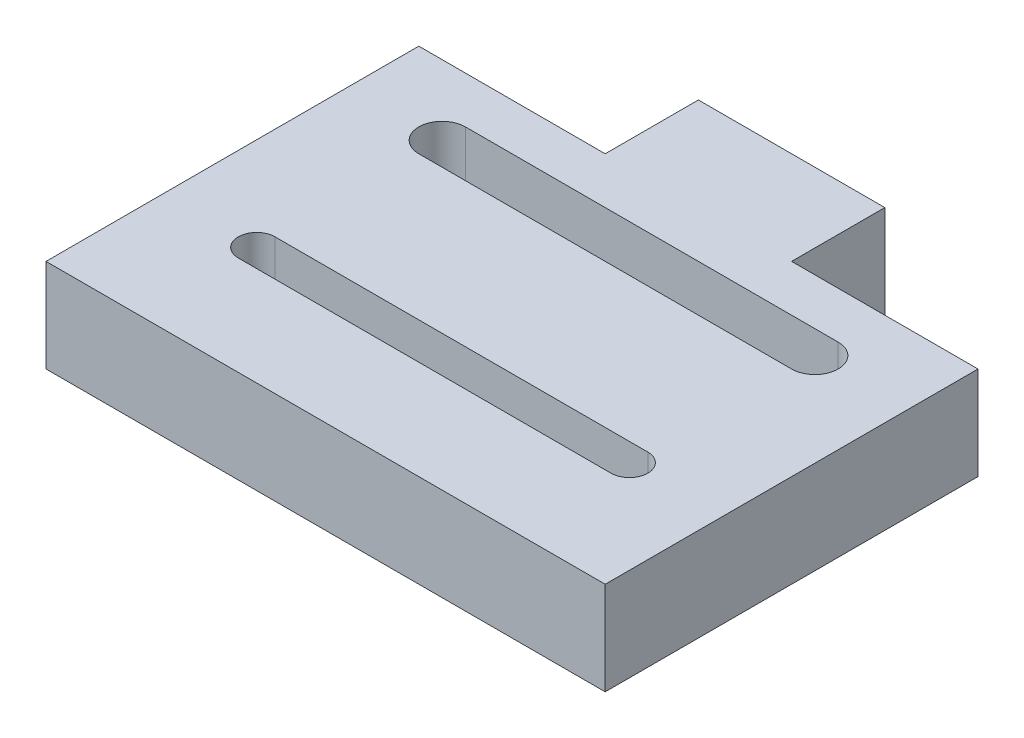
ISO-10303-21;
HEADER;
FILE_DESCRIPTION(('STEP AP214'),'2;1');
FILE_NAME('part.step','',(''),(''),'','','');
FILE_SCHEMA(('AUTOMOTIVE_DESIGN { 1 0 10303 214 1 1 1 1 }'));
ENDSEC;
DATA;
#1=APPLICATION_CONTEXT('core data for automotive mechanical design processes');
#2=APPLICATION_PROTOCOL_DEFINITION('international standard','automotive_design',2000,#1);
#3=PRODUCT_CONTEXT('',#1,'mechanical');
#4=PRODUCT('Part','Part','',(#3));
#5=PRODUCT_RELATED_PRODUCT_CATEGORY('part','',(#4));
#6=PRODUCT_DEFINITION_FORMATION('','',#4);
#7=PRODUCT_DEFINITION_CONTEXT('part definition',#1,'design');
#8=PRODUCT_DEFINITION('design','',#6,#7);
#9=PRODUCT_DEFINITION_SHAPE('','',#8);
#10=(LENGTH_UNIT() NAMED_UNIT(*) SI_UNIT(.MILLI.,.METRE.));
#11=(NAMED_UNIT(*) PLANE_ANGLE_UNIT() SI_UNIT($,.RADIAN.));
#12=(NAMED_UNIT(*) SI_UNIT($,.STERADIAN.) SOLID_ANGLE_UNIT());
#13=UNCERTAINTY_MEASURE_WITH_UNIT(LENGTH_MEASURE(1.E-05),#10,'distance_accuracy_value','');
#14=(GEOMETRIC_REPRESENTATION_CONTEXT(3) GLOBAL_UNCERTAINTY_ASSIGNED_CONTEXT((#13)) GLOBAL_UNIT_ASSIGNED_CONTEXT((#10,
#11,#12)) REPRESENTATION_CONTEXT('',''));
#15=CARTESIAN_POINT('',(0.,0.,0.));
#16=DIRECTION('',(0.,0.,1.));
#17=DIRECTION('',(1.,0.,0.));
#18=AXIS2_PLACEMENT_3D('',#15,#16,#17);
#19=CARTESIAN_POINT('',(19.05,-6.34833682660208,25.4));
#20=DIRECTION('',(0.,-1.,0.));
#21=DIRECTION('',(0.,0.,-1.));
#22=AXIS2_PLACEMENT_3D('',#19,#20,#21);
#23=PLANE('',#22);
#24=CARTESIAN_POINT('',(-12.7,-6.34833682660208,17.399));
#25=DIRECTION('',(0.,1.,0.));
#26=DIRECTION('',(0.,0.,1.));
#27=AXIS2_PLACEMENT_3D('',#24,#25,#26);
#28=CIRCLE('',#27,1.25);
#29=CARTESIAN_POINT('',(-12.7,-6.34833682660208,18.649));
#30=VERTEX_POINT('',#29);
#31=CARTESIAN_POINT('',(-12.7,-6.34833682660208,16.149));
#32=VERTEX_POINT('',#31);
#33=EDGE_CURVE('E297',#30,#32,#28,.F.);
#34=ORIENTED_EDGE('',*,*,#33,.T.);
#35=DIRECTION('',(-1.,0.,0.));
#36=VECTOR('',#35,1.);
#37=CARTESIAN_POINT('',(0.,-6.34833682660208,16.149));
#38=LINE('',#37,#36);
#39=CARTESIAN_POINT('',(12.7,-6.34833682660208,16.149));
#40=VERTEX_POINT('',#39);
#41=EDGE_CURVE('E294',#40,#32,#38,.T.);
#42=ORIENTED_EDGE('',*,*,#41,.F.);
#43=CARTESIAN_POINT('',(12.7,-6.34833682660208,17.399));
#44=DIRECTION('',(0.,1.,0.));
#45=DIRECTION('',(0.,0.,1.));
#46=AXIS2_PLACEMENT_3D('',#43,#44,#45);
#47=CIRCLE('',#46,1.25);
#48=CARTESIAN_POINT('',(12.7,-6.34833682660208,18.649));
#49=VERTEX_POINT('',#48);
#50=EDGE_CURVE('E310',#49,#40,#47,.T.);
#51=ORIENTED_EDGE('',*,*,#50,.F.);
#52=DIRECTION('',(-1.,0.,0.));
#53=VECTOR('',#52,1.);
#54=CARTESIAN_POINT('',(0.,-6.34833682660208,18.649));
#55=LINE('',#54,#53);
#56=EDGE_CURVE('E302',#49,#30,#55,.T.);
#57=ORIENTED_EDGE('',*,*,#56,.T.);
#58=EDGE_LOOP('',(#34,#42,#51,#57));
#59=FACE_BOUND('',#58,.T.);
#60=DIRECTION('',(-1.,0.,0.));
#61=VECTOR('',#60,1.);
#62=CARTESIAN_POINT('',(19.05,-6.34833682660208,0.));
#63=LINE('',#62,#61);
#64=CARTESIAN_POINT('',(19.05,-6.34833682660208,0.));
#65=VERTEX_POINT('',#64);
#66=CARTESIAN_POINT('',(6.35000000000001,-6.34833682660208,0.));
#67=VERTEX_POINT('',#66);
#68=EDGE_CURVE('E342',#65,#67,#63,.T.);
#69=ORIENTED_EDGE('',*,*,#68,.T.);
#70=DIRECTION('',(0.,0.,1.));
#71=VECTOR('',#70,1.);
#72=CARTESIAN_POINT('',(6.35,-6.34833682660247,-6.35));
#73=LINE('',#72,#71);
#74=CARTESIAN_POINT('',(6.35,-6.34833682660247,-6.35));
#75=VERTEX_POINT('',#74);
#76=EDGE_CURVE('E182',#75,#67,#73,.T.);
#77=ORIENTED_EDGE('',*,*,#76,.F.);
#78=DIRECTION('',(1.,0.,0.));
#79=VECTOR('',#78,1.);
#80=CARTESIAN_POINT('',(6.35,-6.34833682660247,-6.35));
#81=LINE('',#80,#79);
#82=CARTESIAN_POINT('',(-6.35,-6.34833682660247,-6.35));
#83=VERTEX_POINT('',#82);
#84=EDGE_CURVE('E180',#83,#75,#81,.T.);
#85=ORIENTED_EDGE('',*,*,#84,.F.);
#86=DIRECTION('',(0.,0.,1.));
#87=VECTOR('',#86,1.);
#88=CARTESIAN_POINT('',(-6.35,-6.34833682660247,-6.35));
#89=LINE('',#88,#87);
#90=CARTESIAN_POINT('',(-6.35,-6.34833682660247,0.));
#91=VERTEX_POINT('',#90);
#92=EDGE_CURVE('E195',#83,#91,#89,.T.);
#93=ORIENTED_EDGE('',*,*,#92,.T.);
#94=CARTESIAN_POINT('',(-19.05,-6.34833682660208,0.));
#95=VERTEX_POINT('',#94);
#96=EDGE_CURVE('E282',#91,#95,#63,.T.);
#97=ORIENTED_EDGE('',*,*,#96,.T.);
#98=DIRECTION('',(0.,0.,-1.));
#99=VECTOR('',#98,1.);
#100=CARTESIAN_POINT('',(-19.05,-6.34833682660208,25.4));
#101=LINE('',#100,#99);
#102=CARTESIAN_POINT('',(-19.05,-6.34833682660208,25.4));
#103=VERTEX_POINT('',#102);
#104=EDGE_CURVE('E355',#103,#95,#101,.T.);
#105=ORIENTED_EDGE('',*,*,#104,.F.);
#106=DIRECTION('',(-1.,0.,0.));
#107=VECTOR('',#106,1.);
#108=CARTESIAN_POINT('',(19.05,-6.34833682660208,25.4));
#109=LINE('',#108,#107);
#110=CARTESIAN_POINT('',(19.05,-6.34833682660208,25.4));
#111=VERTEX_POINT('',#110);
#112=EDGE_CURVE('E326',#111,#103,#109,.T.);
#113=ORIENTED_EDGE('',*,*,#112,.F.);
#114=DIRECTION('',(0.,0.,-1.));
#115=VECTOR('',#114,1.);
#116=CARTESIAN_POINT('',(19.05,-6.34833682660208,25.4));
#117=LINE('',#116,#115);
#118=EDGE_CURVE('E200',#111,#65,#117,.T.);
#119=ORIENTED_EDGE('',*,*,#118,.T.);
#120=EDGE_LOOP('',(#69,#77,#85,#93,#97,#105,#113,#119));
#121=FACE_BOUND('',#120,.T.);
#122=DIRECTION('',(-1.,0.,0.));
#123=VECTOR('',#122,1.);
#124=CARTESIAN_POINT('',(0.,-6.34833682660208,6.35));
#125=LINE('',#124,#123);
#126=CARTESIAN_POINT('',(12.7,-6.34833682660209,6.35));
#127=VERTEX_POINT('',#126);
#128=CARTESIAN_POINT('',(-12.7,-6.34833682660208,6.35));
#129=VERTEX_POINT('',#128);
#130=EDGE_CURVE('E48',#127,#129,#125,.T.);
#131=ORIENTED_EDGE('',*,*,#130,.T.);
#132=CARTESIAN_POINT('',(-12.7,-6.34833682660208,4.7625));
#133=DIRECTION('',(0.,1.,0.));
#134=DIRECTION('',(0.,0.,1.));
#135=AXIS2_PLACEMENT_3D('',#132,#133,#134);
#136=CIRCLE('',#135,1.5875);
#137=CARTESIAN_POINT('',(-12.7,-6.34833682660208,3.175));
#138=VERTEX_POINT('',#137);
#139=EDGE_CURVE('E162',#129,#138,#136,.F.);
#140=ORIENTED_EDGE('',*,*,#139,.T.);
#141=DIRECTION('',(-1.,0.,0.));
#142=VECTOR('',#141,1.);
#143=CARTESIAN_POINT('',(0.,-6.34833682660208,3.175));
#144=LINE('',#143,#142);
#145=CARTESIAN_POINT('',(12.7,-6.34833682660208,3.175));
#146=VERTEX_POINT('',#145);
#147=EDGE_CURVE('E148',#146,#138,#144,.T.);
#148=ORIENTED_EDGE('',*,*,#147,.F.);
#149=CARTESIAN_POINT('',(12.7,-6.34833682660208,4.7625));
#150=DIRECTION('',(0.,1.,0.));
#151=DIRECTION('',(0.,0.,1.));
#152=AXIS2_PLACEMENT_3D('',#149,#150,#151);
#153=CIRCLE('',#152,1.5875);
#154=EDGE_CURVE('E157',#127,#146,#153,.T.);
#155=ORIENTED_EDGE('',*,*,#154,.F.);
#156=EDGE_LOOP('',(#131,#140,#148,#155));
#157=FACE_BOUND('',#156,.T.);
#158=ADVANCED_FACE('F33',(#59,#121,#157),#23,.F.);
#159=CARTESIAN_POINT('',(19.05,-12.6983368266021,25.4));
#160=DIRECTION('',(0.,1.,0.));
#161=DIRECTION('',(0.,0.,1.));
#162=AXIS2_PLACEMENT_3D('',#159,#160,#161);
#163=PLANE('',#162);
#164=CARTESIAN_POINT('',(12.7,-12.6983368266021,17.399));
#165=DIRECTION('',(0.,1.,0.));
#166=DIRECTION('',(0.,0.,1.));
#167=AXIS2_PLACEMENT_3D('',#164,#165,#166);
#168=CIRCLE('',#167,1.25);
#169=CARTESIAN_POINT('',(12.7,-12.6983368266021,18.649));
#170=VERTEX_POINT('',#169);
#171=CARTESIAN_POINT('',(12.7,-12.6983368266021,16.149));
#172=VERTEX_POINT('',#171);
#173=EDGE_CURVE('E305',#170,#172,#168,.T.);
#174=ORIENTED_EDGE('',*,*,#173,.T.);
#175=DIRECTION('',(-1.,0.,0.));
#176=VECTOR('',#175,1.);
#177=CARTESIAN_POINT('',(0.,-12.6983368266021,16.149));
#178=LINE('',#177,#176);
#179=CARTESIAN_POINT('',(-12.7,-12.6983368266021,16.149));
#180=VERTEX_POINT('',#179);
#181=EDGE_CURVE('E313',#172,#180,#178,.T.);
#182=ORIENTED_EDGE('',*,*,#181,.T.);
#183=CARTESIAN_POINT('',(-12.7,-12.6983368266021,17.399));
#184=DIRECTION('',(0.,1.,0.));
#185=DIRECTION('',(0.,0.,1.));
#186=AXIS2_PLACEMENT_3D('',#183,#184,#185);
#187=CIRCLE('',#186,1.25);
#188=CARTESIAN_POINT('',(-12.7,-12.6983368266021,18.649));
#189=VERTEX_POINT('',#188);
#190=EDGE_CURVE('E487',#189,#180,#187,.F.);
#191=ORIENTED_EDGE('',*,*,#190,.F.);
#192=DIRECTION('',(-1.,0.,0.));
#193=VECTOR('',#192,1.);
#194=CARTESIAN_POINT('',(0.,-12.6983368266021,18.649));
#195=LINE('',#194,#193);
#196=EDGE_CURVE('E482',#170,#189,#195,.T.);
#197=ORIENTED_EDGE('',*,*,#196,.F.);
#198=EDGE_LOOP('',(#174,#182,#191,#197));
#199=FACE_BOUND('',#198,.T.);
#200=DIRECTION('',(1.,0.,0.));
#201=VECTOR('',#200,1.);
#202=CARTESIAN_POINT('',(19.05,-12.6983368266021,0.));
#203=LINE('',#202,#201);
#204=CARTESIAN_POINT('',(-19.05,-12.6983368266021,0.));
#205=VERTEX_POINT('',#204);
#206=CARTESIAN_POINT('',(-6.34999999999998,-12.6983368266021,0.));
#207=VERTEX_POINT('',#206);
#208=EDGE_CURVE('E327',#205,#207,#203,.T.);
#209=ORIENTED_EDGE('',*,*,#208,.T.);
#210=DIRECTION('',(0.,0.,1.));
#211=VECTOR('',#210,1.);
#212=CARTESIAN_POINT('',(-6.35,-12.6983368266025,-6.35));
#213=LINE('',#212,#211);
#214=CARTESIAN_POINT('',(-6.35,-12.6983368266025,-6.35));
#215=VERTEX_POINT('',#214);
#216=EDGE_CURVE('E275',#215,#207,#213,.T.);
#217=ORIENTED_EDGE('',*,*,#216,.F.);
#218=DIRECTION('',(-1.,0.,0.));
#219=VECTOR('',#218,1.);
#220=CARTESIAN_POINT('',(6.35,-12.6983368266025,-6.35));
#221=LINE('',#220,#219);
#222=CARTESIAN_POINT('',(6.35,-12.6983368266025,-6.35));
#223=VERTEX_POINT('',#222);
#224=EDGE_CURVE('E175',#223,#215,#221,.T.);
#225=ORIENTED_EDGE('',*,*,#224,.F.);
#226=DIRECTION('',(0.,0.,1.));
#227=VECTOR('',#226,1.);
#228=CARTESIAN_POINT('',(6.35,-12.6983368266025,-6.35));
#229=LINE('',#228,#227);
#230=CARTESIAN_POINT('',(6.35000000000001,-12.6983368266021,0.));
#231=VERTEX_POINT('',#230);
#232=EDGE_CURVE('E286',#223,#231,#229,.T.);
#233=ORIENTED_EDGE('',*,*,#232,.T.);
#234=CARTESIAN_POINT('',(19.05,-12.6983368266021,0.));
#235=VERTEX_POINT('',#234);
#236=EDGE_CURVE('E344',#231,#235,#203,.T.);
#237=ORIENTED_EDGE('',*,*,#236,.T.);
#238=DIRECTION('',(0.,0.,-1.));
#239=VECTOR('',#238,1.);
#240=CARTESIAN_POINT('',(19.05,-12.6983368266021,25.4));
#241=LINE('',#240,#239);
#242=CARTESIAN_POINT('',(19.05,-12.6983368266021,25.4));
#243=VERTEX_POINT('',#242);
#244=EDGE_CURVE('E333',#243,#235,#241,.T.);
#245=ORIENTED_EDGE('',*,*,#244,.F.);
#246=DIRECTION('',(1.,0.,0.));
#247=VECTOR('',#246,1.);
#248=CARTESIAN_POINT('',(19.05,-12.6983368266021,25.4));
#249=LINE('',#248,#247);
#250=CARTESIAN_POINT('',(-19.05,-12.6983368266021,25.4));
#251=VERTEX_POINT('',#250);
#252=EDGE_CURVE('E331',#251,#243,#249,.T.);
#253=ORIENTED_EDGE('',*,*,#252,.F.);
#254=DIRECTION('',(0.,0.,-1.));
#255=VECTOR('',#254,1.);
#256=CARTESIAN_POINT('',(-19.05,-12.6983368266021,25.4));
#257=LINE('',#256,#255);
#258=EDGE_CURVE('E352',#251,#205,#257,.T.);
#259=ORIENTED_EDGE('',*,*,#258,.T.);
#260=EDGE_LOOP('',(#209,#217,#225,#233,#237,#245,#253,#259));
#261=FACE_BOUND('',#260,.T.);
#262=DIRECTION('',(-1.,0.,0.));
#263=VECTOR('',#262,1.);
#264=CARTESIAN_POINT('',(19.05,-12.6983368266021,6.35));
#265=LINE('',#264,#263);
#266=CARTESIAN_POINT('',(12.7,-12.6983368266021,6.35));
#267=VERTEX_POINT('',#266);
#268=CARTESIAN_POINT('',(-12.7,-12.6983368266021,6.35));
#269=VERTEX_POINT('',#268);
#270=EDGE_CURVE('E11',#267,#269,#265,.T.);
#271=ORIENTED_EDGE('',*,*,#270,.F.);
#272=CARTESIAN_POINT('',(12.7,-12.6983368266021,4.7625));
#273=DIRECTION('',(0.,1.,0.));
#274=DIRECTION('',(0.,0.,1.));
#275=AXIS2_PLACEMENT_3D('',#272,#273,#274);
#276=CIRCLE('',#275,1.5875);
#277=CARTESIAN_POINT('',(12.7,-12.6983368266021,3.175));
#278=VERTEX_POINT('',#277);
#279=EDGE_CURVE('E198',#267,#278,#276,.T.);
#280=ORIENTED_EDGE('',*,*,#279,.T.);
#281=DIRECTION('',(-1.,0.,0.));
#282=VECTOR('',#281,1.);
#283=CARTESIAN_POINT('',(19.05,-12.6983368266021,3.175));
#284=LINE('',#283,#282);
#285=CARTESIAN_POINT('',(-12.7,-12.6983368266021,3.175));
#286=VERTEX_POINT('',#285);
#287=EDGE_CURVE('E151',#278,#286,#284,.T.);
#288=ORIENTED_EDGE('',*,*,#287,.T.);
#289=CARTESIAN_POINT('',(-12.7,-12.6983368266021,4.7625));
#290=DIRECTION('',(0.,1.,0.));
#291=DIRECTION('',(0.,0.,1.));
#292=AXIS2_PLACEMENT_3D('',#289,#290,#291);
#293=CIRCLE('',#292,1.5875);
#294=EDGE_CURVE('E41',#269,#286,#293,.F.);
#295=ORIENTED_EDGE('',*,*,#294,.F.);
#296=EDGE_LOOP('',(#271,#280,#288,#295));
#297=FACE_BOUND('',#296,.T.);
#298=ADVANCED_FACE('F207',(#199,#261,#297),#163,.F.);
#299=CARTESIAN_POINT('',(0.,0.,0.));
#300=DIRECTION('',(0.,0.,1.));
#301=DIRECTION('',(1.,0.,0.));
#302=AXIS2_PLACEMENT_3D('',#299,#300,#301);
#303=PLANE('',#302);
#304=DIRECTION('',(0.,-1.,0.));
#305=VECTOR('',#304,1.);
#306=CARTESIAN_POINT('',(6.35,-12.6983368266025,0.));
#307=LINE('',#306,#305);
#308=EDGE_CURVE('E169',#67,#231,#307,.T.);
#309=ORIENTED_EDGE('',*,*,#308,.F.);
#310=ORIENTED_EDGE('',*,*,#68,.F.);
#311=DIRECTION('',(0.,1.,0.));
#312=VECTOR('',#311,1.);
#313=CARTESIAN_POINT('',(19.05,-12.6983368266021,0.));
#314=LINE('',#313,#312);
#315=EDGE_CURVE('E316',#235,#65,#314,.T.);
#316=ORIENTED_EDGE('',*,*,#315,.F.);
#317=ORIENTED_EDGE('',*,*,#236,.F.);
#318=EDGE_LOOP('',(#309,#310,#316,#317));
#319=FACE_BOUND('',#318,.T.);
#320=ADVANCED_FACE('F226',(#319),#303,.F.);
#321=DIRECTION('',(0.,1.,0.));
#322=VECTOR('',#321,1.);
#323=CARTESIAN_POINT('',(-6.35,-12.6983368266025,0.));
#324=LINE('',#323,#322);
#325=EDGE_CURVE('E176',#207,#91,#324,.T.);
#326=ORIENTED_EDGE('',*,*,#325,.F.);
#327=ORIENTED_EDGE('',*,*,#208,.F.);
#328=DIRECTION('',(0.,-1.,0.));
#329=VECTOR('',#328,1.);
#330=CARTESIAN_POINT('',(-19.05,-12.6983368266021,0.));
#331=LINE('',#330,#329);
#332=EDGE_CURVE('E338',#95,#205,#331,.T.);
#333=ORIENTED_EDGE('',*,*,#332,.F.);
#334=ORIENTED_EDGE('',*,*,#96,.F.);
#335=EDGE_LOOP('',(#326,#327,#333,#334));
#336=FACE_BOUND('',#335,.T.);
#337=ADVANCED_FACE('F239',(#336),#303,.F.);
#338=CARTESIAN_POINT('',(19.05,-12.6983368266021,25.4));
#339=DIRECTION('',(-1.,0.,0.));
#340=DIRECTION('',(0.,0.,1.));
#341=AXIS2_PLACEMENT_3D('',#338,#339,#340);
#342=PLANE('',#341);
#343=ORIENTED_EDGE('',*,*,#315,.T.);
#344=ORIENTED_EDGE('',*,*,#118,.F.);
#345=DIRECTION('',(0.,1.,0.));
#346=VECTOR('',#345,1.);
#347=CARTESIAN_POINT('',(19.05,-12.6983368266021,25.4));
#348=LINE('',#347,#346);
#349=EDGE_CURVE('E323',#243,#111,#348,.T.);
#350=ORIENTED_EDGE('',*,*,#349,.F.);
#351=ORIENTED_EDGE('',*,*,#244,.T.);
#352=EDGE_LOOP('',(#343,#344,#350,#351));
#353=FACE_BOUND('',#352,.T.);
#354=ADVANCED_FACE('F35',(#353),#342,.F.);
#355=CARTESIAN_POINT('',(-19.05,-12.6983368266021,25.4));
#356=DIRECTION('',(1.,0.,0.));
#357=DIRECTION('',(0.,0.,-1.));
#358=AXIS2_PLACEMENT_3D('',#355,#356,#357);
#359=PLANE('',#358);
#360=ORIENTED_EDGE('',*,*,#332,.T.);
#361=ORIENTED_EDGE('',*,*,#258,.F.);
#362=DIRECTION('',(0.,-1.,0.));
#363=VECTOR('',#362,1.);
#364=CARTESIAN_POINT('',(-19.05,-12.6983368266021,25.4));
#365=LINE('',#364,#363);
#366=EDGE_CURVE('E329',#103,#251,#365,.T.);
#367=ORIENTED_EDGE('',*,*,#366,.F.);
#368=ORIENTED_EDGE('',*,*,#104,.T.);
#369=EDGE_LOOP('',(#360,#361,#367,#368));
#370=FACE_BOUND('',#369,.T.);
#371=ADVANCED_FACE('F232',(#370),#359,.F.);
#372=CARTESIAN_POINT('',(0.,0.,25.4));
#373=DIRECTION('',(0.,0.,1.));
#374=DIRECTION('',(1.,0.,0.));
#375=AXIS2_PLACEMENT_3D('',#372,#373,#374);
#376=PLANE('',#375);
#377=ORIENTED_EDGE('',*,*,#349,.T.);
#378=ORIENTED_EDGE('',*,*,#112,.T.);
#379=ORIENTED_EDGE('',*,*,#366,.T.);
#380=ORIENTED_EDGE('',*,*,#252,.T.);
#381=EDGE_LOOP('',(#377,#378,#379,#380));
#382=FACE_BOUND('',#381,.T.);
#383=ADVANCED_FACE('F234',(#382),#376,.T.);
#384=CARTESIAN_POINT('',(0.,-12.6983368266021,16.149));
#385=DIRECTION('',(0.,0.,-1.));
#386=DIRECTION('',(-1.,0.,0.));
#387=AXIS2_PLACEMENT_3D('',#384,#385,#386);
#388=PLANE('',#387);
#389=ORIENTED_EDGE('',*,*,#41,.T.);
#390=DIRECTION('',(0.,1.,0.));
#391=VECTOR('',#390,1.);
#392=CARTESIAN_POINT('',(-12.7,-12.6983368266021,16.149));
#393=LINE('',#392,#391);
#394=EDGE_CURVE('E321',#180,#32,#393,.T.);
#395=ORIENTED_EDGE('',*,*,#394,.F.);
#396=ORIENTED_EDGE('',*,*,#181,.F.);
#397=DIRECTION('',(0.,1.,0.));
#398=VECTOR('',#397,1.);
#399=CARTESIAN_POINT('',(12.7,-12.6983368266021,16.149));
#400=LINE('',#399,#398);
#401=EDGE_CURVE('E314',#172,#40,#400,.T.);
#402=ORIENTED_EDGE('',*,*,#401,.T.);
#403=EDGE_LOOP('',(#389,#395,#396,#402));
#404=FACE_BOUND('',#403,.T.);
#405=ADVANCED_FACE('F243',(#404),#388,.F.);
#406=CARTESIAN_POINT('',(12.7,-12.6983368266021,17.399));
#407=DIRECTION('',(0.,1.,0.));
#408=DIRECTION('',(0.,0.,1.));
#409=AXIS2_PLACEMENT_3D('',#406,#407,#408);
#410=CYLINDRICAL_SURFACE('',#409,1.25);
#411=ORIENTED_EDGE('',*,*,#50,.T.);
#412=ORIENTED_EDGE('',*,*,#401,.F.);
#413=ORIENTED_EDGE('',*,*,#173,.F.);
#414=DIRECTION('',(0.,1.,0.));
#415=VECTOR('',#414,1.);
#416=CARTESIAN_POINT('',(12.7,-12.6983368266021,18.649));
#417=LINE('',#416,#415);
#418=EDGE_CURVE('E317',#170,#49,#417,.T.);
#419=ORIENTED_EDGE('',*,*,#418,.T.);
#420=EDGE_LOOP('',(#411,#412,#413,#419));
#421=FACE_BOUND('',#420,.T.);
#422=ADVANCED_FACE('F247',(#421),#410,.F.);
#423=CARTESIAN_POINT('',(0.,-12.6983368266021,18.649));
#424=DIRECTION('',(0.,0.,-1.));
#425=DIRECTION('',(-1.,0.,0.));
#426=AXIS2_PLACEMENT_3D('',#423,#424,#425);
#427=PLANE('',#426);
#428=ORIENTED_EDGE('',*,*,#56,.F.);
#429=ORIENTED_EDGE('',*,*,#418,.F.);
#430=ORIENTED_EDGE('',*,*,#196,.T.);
#431=DIRECTION('',(0.,1.,0.));
#432=VECTOR('',#431,1.);
#433=CARTESIAN_POINT('',(-12.7,-12.6983368266021,18.649));
#434=LINE('',#433,#432);
#435=EDGE_CURVE('E319',#189,#30,#434,.T.);
#436=ORIENTED_EDGE('',*,*,#435,.T.);
#437=EDGE_LOOP('',(#428,#429,#430,#436));
#438=FACE_BOUND('',#437,.T.);
#439=ADVANCED_FACE('F253',(#438),#427,.T.);
#440=CARTESIAN_POINT('',(-12.7,-12.6983368266021,17.399));
#441=DIRECTION('',(0.,1.,0.));
#442=DIRECTION('',(0.,0.,1.));
#443=AXIS2_PLACEMENT_3D('',#440,#441,#442);
#444=CYLINDRICAL_SURFACE('',#443,1.25);
#445=ORIENTED_EDGE('',*,*,#33,.F.);
#446=ORIENTED_EDGE('',*,*,#435,.F.);
#447=ORIENTED_EDGE('',*,*,#190,.T.);
#448=ORIENTED_EDGE('',*,*,#394,.T.);
#449=EDGE_LOOP('',(#445,#446,#447,#448));
#450=FACE_BOUND('',#449,.T.);
#451=ADVANCED_FACE('F249',(#450),#444,.F.);
#452=CARTESIAN_POINT('',(6.35,-12.6983368266025,-6.35));
#453=DIRECTION('',(-1.,0.,0.));
#454=DIRECTION('',(0.,0.,1.));
#455=AXIS2_PLACEMENT_3D('',#452,#453,#454);
#456=PLANE('',#455);
#457=ORIENTED_EDGE('',*,*,#308,.T.);
#458=ORIENTED_EDGE('',*,*,#232,.F.);
#459=DIRECTION('',(0.,-1.,0.));
#460=VECTOR('',#459,1.);
#461=CARTESIAN_POINT('',(6.35,-12.6983368266025,-6.35));
#462=LINE('',#461,#460);
#463=EDGE_CURVE('E172',#75,#223,#462,.T.);
#464=ORIENTED_EDGE('',*,*,#463,.F.);
#465=ORIENTED_EDGE('',*,*,#76,.T.);
#466=EDGE_LOOP('',(#457,#458,#464,#465));
#467=FACE_BOUND('',#466,.T.);
#468=ADVANCED_FACE('F252',(#467),#456,.F.);
#469=CARTESIAN_POINT('',(-6.35,-12.6983368266025,-6.35));
#470=DIRECTION('',(1.,0.,0.));
#471=DIRECTION('',(0.,0.,-1.));
#472=AXIS2_PLACEMENT_3D('',#469,#470,#471);
#473=PLANE('',#472);
#474=ORIENTED_EDGE('',*,*,#325,.T.);
#475=ORIENTED_EDGE('',*,*,#92,.F.);
#476=DIRECTION('',(0.,1.,0.));
#477=VECTOR('',#476,1.);
#478=CARTESIAN_POINT('',(-6.35,-12.6983368266025,-6.35));
#479=LINE('',#478,#477);
#480=EDGE_CURVE('E178',#215,#83,#479,.T.);
#481=ORIENTED_EDGE('',*,*,#480,.F.);
#482=ORIENTED_EDGE('',*,*,#216,.T.);
#483=EDGE_LOOP('',(#474,#475,#481,#482));
#484=FACE_BOUND('',#483,.T.);
#485=ADVANCED_FACE('F217',(#484),#473,.F.);
#486=CARTESIAN_POINT('',(0.,0.,-6.35));
#487=DIRECTION('',(0.,0.,1.));
#488=DIRECTION('',(1.,0.,0.));
#489=AXIS2_PLACEMENT_3D('',#486,#487,#488);
#490=PLANE('',#489);
#491=ORIENTED_EDGE('',*,*,#463,.T.);
#492=ORIENTED_EDGE('',*,*,#224,.T.);
#493=ORIENTED_EDGE('',*,*,#480,.T.);
#494=ORIENTED_EDGE('',*,*,#84,.T.);
#495=EDGE_LOOP('',(#491,#492,#493,#494));
#496=FACE_BOUND('',#495,.T.);
#497=ADVANCED_FACE('F210',(#496),#490,.F.);
#498=CARTESIAN_POINT('',(0.,-16.3483368266021,6.35));
#499=DIRECTION('',(0.,0.,-1.));
#500=DIRECTION('',(-1.,0.,0.));
#501=AXIS2_PLACEMENT_3D('',#498,#499,#500);
#502=PLANE('',#501);
#503=ORIENTED_EDGE('',*,*,#270,.T.);
#504=DIRECTION('',(0.,1.,0.));
#505=VECTOR('',#504,1.);
#506=CARTESIAN_POINT('',(-12.7,-16.3483368266021,6.35));
#507=LINE('',#506,#505);
#508=EDGE_CURVE('E167',#269,#129,#507,.T.);
#509=ORIENTED_EDGE('',*,*,#508,.T.);
#510=ORIENTED_EDGE('',*,*,#130,.F.);
#511=DIRECTION('',(0.,1.,0.));
#512=VECTOR('',#511,1.);
#513=CARTESIAN_POINT('',(12.7,-16.3483368266021,6.35));
#514=LINE('',#513,#512);
#515=EDGE_CURVE('E154',#267,#127,#514,.T.);
#516=ORIENTED_EDGE('',*,*,#515,.F.);
#517=EDGE_LOOP('',(#503,#509,#510,#516));
#518=FACE_BOUND('',#517,.T.);
#519=ADVANCED_FACE('F208',(#518),#502,.T.);
#520=CARTESIAN_POINT('',(-12.7,-16.3483368266021,4.7625));
#521=DIRECTION('',(0.,1.,0.));
#522=DIRECTION('',(0.,0.,1.));
#523=AXIS2_PLACEMENT_3D('',#520,#521,#522);
#524=CYLINDRICAL_SURFACE('',#523,1.5875);
#525=ORIENTED_EDGE('',*,*,#294,.T.);
#526=DIRECTION('',(0.,1.,0.));
#527=VECTOR('',#526,1.);
#528=CARTESIAN_POINT('',(-12.7,-16.3483368266021,3.175));
#529=LINE('',#528,#527);
#530=EDGE_CURVE('E153',#286,#138,#529,.T.);
#531=ORIENTED_EDGE('',*,*,#530,.T.);
#532=ORIENTED_EDGE('',*,*,#139,.F.);
#533=ORIENTED_EDGE('',*,*,#508,.F.);
#534=EDGE_LOOP('',(#525,#531,#532,#533));
#535=FACE_BOUND('',#534,.T.);
#536=ADVANCED_FACE('F204',(#535),#524,.F.);
#537=CARTESIAN_POINT('',(0.,-16.3483368266021,3.175));
#538=DIRECTION('',(0.,0.,-1.));
#539=DIRECTION('',(-1.,0.,0.));
#540=AXIS2_PLACEMENT_3D('',#537,#538,#539);
#541=PLANE('',#540);
#542=DIRECTION('',(0.,1.,0.));
#543=VECTOR('',#542,1.);
#544=CARTESIAN_POINT('',(12.7,-16.3483368266021,3.175));
#545=LINE('',#544,#543);
#546=EDGE_CURVE('E56',#278,#146,#545,.T.);
#547=ORIENTED_EDGE('',*,*,#546,.T.);
#548=ORIENTED_EDGE('',*,*,#147,.T.);
#549=ORIENTED_EDGE('',*,*,#530,.F.);
#550=ORIENTED_EDGE('',*,*,#287,.F.);
#551=EDGE_LOOP('',(#547,#548,#549,#550));
#552=FACE_BOUND('',#551,.T.);
#553=ADVANCED_FACE('F145',(#552),#541,.F.);
#554=CARTESIAN_POINT('',(12.7,-16.3483368266021,4.7625));
#555=DIRECTION('',(0.,1.,0.));
#556=DIRECTION('',(0.,0.,1.));
#557=AXIS2_PLACEMENT_3D('',#554,#555,#556);
#558=CYLINDRICAL_SURFACE('',#557,1.5875);
#559=ORIENTED_EDGE('',*,*,#515,.T.);
#560=ORIENTED_EDGE('',*,*,#154,.T.);
#561=ORIENTED_EDGE('',*,*,#546,.F.);
#562=ORIENTED_EDGE('',*,*,#279,.F.);
#563=EDGE_LOOP('',(#559,#560,#561,#562));
#564=FACE_BOUND('',#563,.T.);
#565=ADVANCED_FACE('F158',(#564),#558,.F.);
#566=CLOSED_SHELL('',(#158,#298,#320,#337,#354,#371,#383,#405,#422,#439,#451,#468,#485,#497,
#519,#536,#553,#565));
#567=MANIFOLD_SOLID_BREP('B2',#566);
#568=ADVANCED_BREP_SHAPE_REPRESENTATION('',(#18,#567),#14);
#569=SHAPE_DEFINITION_REPRESENTATION(#9,#568);
ENDSEC;
END-ISO-10303-21;
